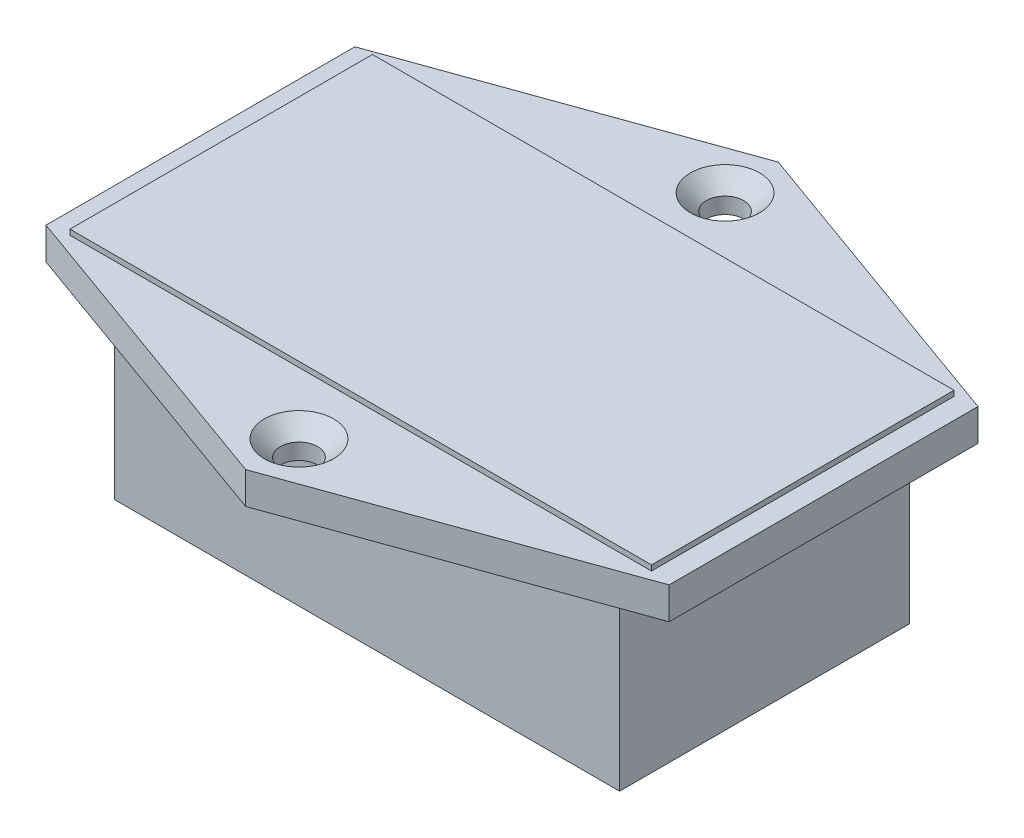
ISO-10303-21;
HEADER;
FILE_DESCRIPTION(('STEP AP214'),'2;1');
FILE_NAME('part.step','',(''),(''),'','','');
FILE_SCHEMA(('AUTOMOTIVE_DESIGN { 1 0 10303 214 1 1 1 1 }'));
ENDSEC;
DATA;
#1=APPLICATION_CONTEXT('core data for automotive mechanical design processes');
#2=APPLICATION_PROTOCOL_DEFINITION('international standard','automotive_design',2000,#1);
#3=PRODUCT_CONTEXT('',#1,'mechanical');
#4=PRODUCT('Part','Part','',(#3));
#5=PRODUCT_RELATED_PRODUCT_CATEGORY('part','',(#4));
#6=PRODUCT_DEFINITION_FORMATION('','',#4);
#7=PRODUCT_DEFINITION_CONTEXT('part definition',#1,'design');
#8=PRODUCT_DEFINITION('design','',#6,#7);
#9=PRODUCT_DEFINITION_SHAPE('','',#8);
#10=(LENGTH_UNIT() NAMED_UNIT(*) SI_UNIT(.MILLI.,.METRE.));
#11=(NAMED_UNIT(*) PLANE_ANGLE_UNIT() SI_UNIT($,.RADIAN.));
#12=(NAMED_UNIT(*) SI_UNIT($,.STERADIAN.) SOLID_ANGLE_UNIT());
#13=UNCERTAINTY_MEASURE_WITH_UNIT(LENGTH_MEASURE(1.E-05),#10,'distance_accuracy_value','');
#14=(GEOMETRIC_REPRESENTATION_CONTEXT(3) GLOBAL_UNCERTAINTY_ASSIGNED_CONTEXT((#13)) GLOBAL_UNIT_ASSIGNED_CONTEXT((#10,
#11,#12)) REPRESENTATION_CONTEXT('',''));
#15=CARTESIAN_POINT('',(0.,0.,0.));
#16=DIRECTION('',(0.,0.,1.));
#17=DIRECTION('',(1.,0.,0.));
#18=AXIS2_PLACEMENT_3D('',#15,#16,#17);
#19=CARTESIAN_POINT('',(0.,-3.,0.));
#20=DIRECTION('',(0.,-1.,0.));
#21=DIRECTION('',(0.,0.,-1.));
#22=AXIS2_PLACEMENT_3D('',#19,#20,#21);
#23=PLANE('',#22);
#24=CARTESIAN_POINT('',(0.,-3.,-20.));
#25=DIRECTION('',(0.,-1.,0.));
#26=DIRECTION('',(0.,0.,-1.));
#27=AXIS2_PLACEMENT_3D('',#24,#25,#26);
#28=CIRCLE('',#27,1.75);
#29=CARTESIAN_POINT('',(0.,-3.,-21.75));
#30=VERTEX_POINT('',#29);
#31=EDGE_CURVE('E149',#30,#30,#28,.T.);
#32=ORIENTED_EDGE('',*,*,#31,.F.);
#33=EDGE_LOOP('',(#32));
#34=FACE_BOUND('',#33,.T.);
#35=DIRECTION('',(-0.941194670761707,0.,-0.337864753606767));
#36=VECTOR('',#35,1.);
#37=CARTESIAN_POINT('',(0.,-3.,25.));
#38=LINE('',#37,#36);
#39=CARTESIAN_POINT('',(0.,-3.,25.));
#40=VERTEX_POINT('',#39);
#41=CARTESIAN_POINT('',(-29.25,-3.,14.5));
#42=VERTEX_POINT('',#41);
#43=EDGE_CURVE('E169',#40,#42,#38,.T.);
#44=ORIENTED_EDGE('',*,*,#43,.T.);
#45=DIRECTION('',(0.,0.,-1.));
#46=VECTOR('',#45,1.);
#47=CARTESIAN_POINT('',(-29.25,-3.,14.5));
#48=LINE('',#47,#46);
#49=CARTESIAN_POINT('',(-29.25,-3.,-14.5));
#50=VERTEX_POINT('',#49);
#51=EDGE_CURVE('E190',#42,#50,#48,.T.);
#52=ORIENTED_EDGE('',*,*,#51,.T.);
#53=DIRECTION('',(0.941194670761707,0.,-0.337864753606767));
#54=VECTOR('',#53,1.);
#55=CARTESIAN_POINT('',(-29.25,-3.,-14.5));
#56=LINE('',#55,#54);
#57=CARTESIAN_POINT('',(0.,-3.,-25.));
#58=VERTEX_POINT('',#57);
#59=EDGE_CURVE('E323',#50,#58,#56,.T.);
#60=ORIENTED_EDGE('',*,*,#59,.T.);
#61=DIRECTION('',(0.941194670761707,0.,0.337864753606767));
#62=VECTOR('',#61,1.);
#63=CARTESIAN_POINT('',(0.,-3.,-25.));
#64=LINE('',#63,#62);
#65=CARTESIAN_POINT('',(29.25,-3.,-14.5));
#66=VERTEX_POINT('',#65);
#67=EDGE_CURVE('E325',#58,#66,#64,.T.);
#68=ORIENTED_EDGE('',*,*,#67,.T.);
#69=DIRECTION('',(0.,0.,1.));
#70=VECTOR('',#69,1.);
#71=CARTESIAN_POINT('',(29.25,-3.,-14.5));
#72=LINE('',#71,#70);
#73=CARTESIAN_POINT('',(29.25,-3.,14.5));
#74=VERTEX_POINT('',#73);
#75=EDGE_CURVE('E326',#66,#74,#72,.T.);
#76=ORIENTED_EDGE('',*,*,#75,.T.);
#77=DIRECTION('',(-0.941194670761707,0.,0.337864753606767));
#78=VECTOR('',#77,1.);
#79=CARTESIAN_POINT('',(29.25,-3.,14.5));
#80=LINE('',#79,#78);
#81=EDGE_CURVE('E157',#74,#40,#80,.T.);
#82=ORIENTED_EDGE('',*,*,#81,.T.);
#83=EDGE_LOOP('',(#44,#52,#60,#68,#76,#82));
#84=FACE_BOUND('',#83,.T.);
#85=CARTESIAN_POINT('',(0.,-3.,20.));
#86=DIRECTION('',(0.,-1.,0.));
#87=DIRECTION('',(0.,0.,-1.));
#88=AXIS2_PLACEMENT_3D('',#85,#86,#87);
#89=CIRCLE('',#88,1.75);
#90=CARTESIAN_POINT('',(0.,-3.,18.25));
#91=VERTEX_POINT('',#90);
#92=EDGE_CURVE('E154',#91,#91,#89,.T.);
#93=ORIENTED_EDGE('',*,*,#92,.F.);
#94=EDGE_LOOP('',(#93));
#95=FACE_BOUND('',#94,.T.);
#96=DIRECTION('',(1.,0.,0.));
#97=VECTOR('',#96,1.);
#98=CARTESIAN_POINT('',(23.7,-3.,-13.6));
#99=LINE('',#98,#97);
#100=CARTESIAN_POINT('',(-23.7,-3.,-13.6));
#101=VERTEX_POINT('',#100);
#102=CARTESIAN_POINT('',(23.7,-3.,-13.6));
#103=VERTEX_POINT('',#102);
#104=EDGE_CURVE('E341',#101,#103,#99,.T.);
#105=ORIENTED_EDGE('',*,*,#104,.F.);
#106=DIRECTION('',(0.,0.,-1.));
#107=VECTOR('',#106,1.);
#108=CARTESIAN_POINT('',(-23.7,-3.,-13.6));
#109=LINE('',#108,#107);
#110=CARTESIAN_POINT('',(-23.7,-3.,13.6));
#111=VERTEX_POINT('',#110);
#112=EDGE_CURVE('E310',#111,#101,#109,.T.);
#113=ORIENTED_EDGE('',*,*,#112,.F.);
#114=DIRECTION('',(-1.,0.,0.));
#115=VECTOR('',#114,1.);
#116=CARTESIAN_POINT('',(23.7,-3.,13.6));
#117=LINE('',#116,#115);
#118=CARTESIAN_POINT('',(23.7,-3.,13.6));
#119=VERTEX_POINT('',#118);
#120=EDGE_CURVE('E303',#119,#111,#117,.T.);
#121=ORIENTED_EDGE('',*,*,#120,.F.);
#122=DIRECTION('',(0.,0.,1.));
#123=VECTOR('',#122,1.);
#124=CARTESIAN_POINT('',(23.7,-3.,-13.6));
#125=LINE('',#124,#123);
#126=EDGE_CURVE('E344',#103,#119,#125,.T.);
#127=ORIENTED_EDGE('',*,*,#126,.F.);
#128=EDGE_LOOP('',(#105,#113,#121,#127));
#129=FACE_BOUND('',#128,.T.);
#130=ADVANCED_FACE('F17',(#34,#84,#95,#129),#23,.T.);
#131=CARTESIAN_POINT('',(-27.3,0.5,14.2));
#132=DIRECTION('',(1.,0.,0.));
#133=DIRECTION('',(0.,0.,-1.));
#134=AXIS2_PLACEMENT_3D('',#131,#132,#133);
#135=PLANE('',#134);
#136=DIRECTION('',(0.,0.,1.));
#137=VECTOR('',#136,1.);
#138=CARTESIAN_POINT('',(-27.3,0.,14.2));
#139=LINE('',#138,#137);
#140=CARTESIAN_POINT('',(-27.3,0.,-14.2));
#141=VERTEX_POINT('',#140);
#142=CARTESIAN_POINT('',(-27.3,0.,14.2));
#143=VERTEX_POINT('',#142);
#144=EDGE_CURVE('E54',#141,#143,#139,.T.);
#145=ORIENTED_EDGE('',*,*,#144,.T.);
#146=DIRECTION('',(0.,-1.,0.));
#147=VECTOR('',#146,1.);
#148=CARTESIAN_POINT('',(-27.3,0.5,14.2));
#149=LINE('',#148,#147);
#150=CARTESIAN_POINT('',(-27.3,0.5,14.2));
#151=VERTEX_POINT('',#150);
#152=EDGE_CURVE('E84',#151,#143,#149,.T.);
#153=ORIENTED_EDGE('',*,*,#152,.F.);
#154=DIRECTION('',(0.,0.,1.));
#155=VECTOR('',#154,1.);
#156=CARTESIAN_POINT('',(-27.3,0.5,14.2));
#157=LINE('',#156,#155);
#158=CARTESIAN_POINT('',(-27.3,0.5,-14.2));
#159=VERTEX_POINT('',#158);
#160=EDGE_CURVE('E75',#159,#151,#157,.T.);
#161=ORIENTED_EDGE('',*,*,#160,.F.);
#162=DIRECTION('',(0.,-1.,0.));
#163=VECTOR('',#162,1.);
#164=CARTESIAN_POINT('',(-27.3,0.5,-14.2));
#165=LINE('',#164,#163);
#166=EDGE_CURVE('E90',#159,#141,#165,.T.);
#167=ORIENTED_EDGE('',*,*,#166,.T.);
#168=EDGE_LOOP('',(#145,#153,#161,#167));
#169=FACE_BOUND('',#168,.T.);
#170=ADVANCED_FACE('F222',(#169),#135,.F.);
#171=CARTESIAN_POINT('',(27.3,0.5,14.2));
#172=DIRECTION('',(0.,0.,-1.));
#173=DIRECTION('',(-1.,0.,0.));
#174=AXIS2_PLACEMENT_3D('',#171,#172,#173);
#175=PLANE('',#174);
#176=DIRECTION('',(1.,0.,0.));
#177=VECTOR('',#176,1.);
#178=CARTESIAN_POINT('',(27.3,0.,14.2));
#179=LINE('',#178,#177);
#180=CARTESIAN_POINT('',(27.3,0.,14.2));
#181=VERTEX_POINT('',#180);
#182=EDGE_CURVE('E62',#143,#181,#179,.T.);
#183=ORIENTED_EDGE('',*,*,#182,.T.);
#184=DIRECTION('',(0.,-1.,0.));
#185=VECTOR('',#184,1.);
#186=CARTESIAN_POINT('',(27.3,0.5,14.2));
#187=LINE('',#186,#185);
#188=CARTESIAN_POINT('',(27.3,0.5,14.2));
#189=VERTEX_POINT('',#188);
#190=EDGE_CURVE('E80',#189,#181,#187,.T.);
#191=ORIENTED_EDGE('',*,*,#190,.F.);
#192=DIRECTION('',(1.,0.,0.));
#193=VECTOR('',#192,1.);
#194=CARTESIAN_POINT('',(27.3,0.5,14.2));
#195=LINE('',#194,#193);
#196=EDGE_CURVE('E68',#151,#189,#195,.T.);
#197=ORIENTED_EDGE('',*,*,#196,.F.);
#198=ORIENTED_EDGE('',*,*,#152,.T.);
#199=EDGE_LOOP('',(#183,#191,#197,#198));
#200=FACE_BOUND('',#199,.T.);
#201=ADVANCED_FACE('F81',(#200),#175,.F.);
#202=CARTESIAN_POINT('',(27.3,0.5,14.2));
#203=DIRECTION('',(-1.,0.,0.));
#204=DIRECTION('',(0.,0.,1.));
#205=AXIS2_PLACEMENT_3D('',#202,#203,#204);
#206=PLANE('',#205);
#207=DIRECTION('',(0.,0.,-1.));
#208=VECTOR('',#207,1.);
#209=CARTESIAN_POINT('',(27.3,0.,14.2));
#210=LINE('',#209,#208);
#211=CARTESIAN_POINT('',(27.3,0.,-14.2));
#212=VERTEX_POINT('',#211);
#213=EDGE_CURVE('E97',#181,#212,#210,.T.);
#214=ORIENTED_EDGE('',*,*,#213,.T.);
#215=DIRECTION('',(0.,-1.,0.));
#216=VECTOR('',#215,1.);
#217=CARTESIAN_POINT('',(27.3,0.5,-14.2));
#218=LINE('',#217,#216);
#219=CARTESIAN_POINT('',(27.3,0.5,-14.2));
#220=VERTEX_POINT('',#219);
#221=EDGE_CURVE('E85',#220,#212,#218,.T.);
#222=ORIENTED_EDGE('',*,*,#221,.F.);
#223=DIRECTION('',(0.,0.,-1.));
#224=VECTOR('',#223,1.);
#225=CARTESIAN_POINT('',(27.3,0.5,14.2));
#226=LINE('',#225,#224);
#227=EDGE_CURVE('E72',#189,#220,#226,.T.);
#228=ORIENTED_EDGE('',*,*,#227,.F.);
#229=ORIENTED_EDGE('',*,*,#190,.T.);
#230=EDGE_LOOP('',(#214,#222,#228,#229));
#231=FACE_BOUND('',#230,.T.);
#232=ADVANCED_FACE('F87',(#231),#206,.F.);
#233=CARTESIAN_POINT('',(27.3,0.5,-14.2));
#234=DIRECTION('',(0.,0.,1.));
#235=DIRECTION('',(1.,0.,0.));
#236=AXIS2_PLACEMENT_3D('',#233,#234,#235);
#237=PLANE('',#236);
#238=DIRECTION('',(-1.,0.,0.));
#239=VECTOR('',#238,1.);
#240=CARTESIAN_POINT('',(27.3,0.,-14.2));
#241=LINE('',#240,#239);
#242=EDGE_CURVE('E99',#212,#141,#241,.T.);
#243=ORIENTED_EDGE('',*,*,#242,.T.);
#244=ORIENTED_EDGE('',*,*,#166,.F.);
#245=DIRECTION('',(-1.,0.,0.));
#246=VECTOR('',#245,1.);
#247=CARTESIAN_POINT('',(27.3,0.5,-14.2));
#248=LINE('',#247,#246);
#249=EDGE_CURVE('E41',#220,#159,#248,.T.);
#250=ORIENTED_EDGE('',*,*,#249,.F.);
#251=ORIENTED_EDGE('',*,*,#221,.T.);
#252=EDGE_LOOP('',(#243,#244,#250,#251));
#253=FACE_BOUND('',#252,.T.);
#254=ADVANCED_FACE('F220',(#253),#237,.F.);
#255=CARTESIAN_POINT('',(0.,0.5,0.));
#256=DIRECTION('',(0.,1.,0.));
#257=DIRECTION('',(0.,0.,1.));
#258=AXIS2_PLACEMENT_3D('',#255,#256,#257);
#259=PLANE('',#258);
#260=ORIENTED_EDGE('',*,*,#160,.T.);
#261=ORIENTED_EDGE('',*,*,#196,.T.);
#262=ORIENTED_EDGE('',*,*,#227,.T.);
#263=ORIENTED_EDGE('',*,*,#249,.T.);
#264=EDGE_LOOP('',(#260,#261,#262,#263));
#265=FACE_BOUND('',#264,.T.);
#266=ADVANCED_FACE('F70',(#265),#259,.T.);
#267=CARTESIAN_POINT('',(0.,0.,0.));
#268=DIRECTION('',(0.,-1.,0.));
#269=DIRECTION('',(0.,0.,-1.));
#270=AXIS2_PLACEMENT_3D('',#267,#268,#269);
#271=PLANE('',#270);
#272=CARTESIAN_POINT('',(0.,0.,-20.));
#273=DIRECTION('',(0.,-1.,0.));
#274=DIRECTION('',(0.,0.,-1.));
#275=AXIS2_PLACEMENT_3D('',#272,#273,#274);
#276=CIRCLE('',#275,3.25);
#277=CARTESIAN_POINT('',(0.,0.,-23.25));
#278=VERTEX_POINT('',#277);
#279=EDGE_CURVE('E108',#278,#278,#276,.T.);
#280=ORIENTED_EDGE('',*,*,#279,.T.);
#281=EDGE_LOOP('',(#280));
#282=FACE_BOUND('',#281,.T.);
#283=CARTESIAN_POINT('',(0.,0.,20.));
#284=DIRECTION('',(0.,-1.,0.));
#285=DIRECTION('',(0.,0.,-1.));
#286=AXIS2_PLACEMENT_3D('',#283,#284,#285);
#287=CIRCLE('',#286,3.25);
#288=CARTESIAN_POINT('',(0.,0.,16.75));
#289=VERTEX_POINT('',#288);
#290=EDGE_CURVE('E105',#289,#289,#287,.T.);
#291=ORIENTED_EDGE('',*,*,#290,.T.);
#292=EDGE_LOOP('',(#291));
#293=FACE_BOUND('',#292,.T.);
#294=DIRECTION('',(-0.941194670761707,0.,-0.337864753606767));
#295=VECTOR('',#294,1.);
#296=CARTESIAN_POINT('',(0.,0.,25.));
#297=LINE('',#296,#295);
#298=CARTESIAN_POINT('',(0.,0.,25.));
#299=VERTEX_POINT('',#298);
#300=CARTESIAN_POINT('',(-29.25,0.,14.5));
#301=VERTEX_POINT('',#300);
#302=EDGE_CURVE('E134',#299,#301,#297,.T.);
#303=ORIENTED_EDGE('',*,*,#302,.F.);
#304=DIRECTION('',(-0.941194670761707,0.,0.337864753606767));
#305=VECTOR('',#304,1.);
#306=CARTESIAN_POINT('',(29.25,0.,14.5));
#307=LINE('',#306,#305);
#308=CARTESIAN_POINT('',(29.25,0.,14.5));
#309=VERTEX_POINT('',#308);
#310=EDGE_CURVE('E138',#309,#299,#307,.T.);
#311=ORIENTED_EDGE('',*,*,#310,.F.);
#312=DIRECTION('',(0.,0.,1.));
#313=VECTOR('',#312,1.);
#314=CARTESIAN_POINT('',(29.25,0.,-14.5));
#315=LINE('',#314,#313);
#316=CARTESIAN_POINT('',(29.25,0.,-14.5));
#317=VERTEX_POINT('',#316);
#318=EDGE_CURVE('E165',#317,#309,#315,.T.);
#319=ORIENTED_EDGE('',*,*,#318,.F.);
#320=DIRECTION('',(0.941194670761707,0.,0.337864753606767));
#321=VECTOR('',#320,1.);
#322=CARTESIAN_POINT('',(0.,0.,-25.));
#323=LINE('',#322,#321);
#324=CARTESIAN_POINT('',(0.,0.,-25.));
#325=VERTEX_POINT('',#324);
#326=EDGE_CURVE('E162',#325,#317,#323,.T.);
#327=ORIENTED_EDGE('',*,*,#326,.F.);
#328=DIRECTION('',(0.941194670761707,0.,-0.337864753606767));
#329=VECTOR('',#328,1.);
#330=CARTESIAN_POINT('',(-29.25,0.,-14.5));
#331=LINE('',#330,#329);
#332=CARTESIAN_POINT('',(-29.25,0.,-14.5));
#333=VERTEX_POINT('',#332);
#334=EDGE_CURVE('E151',#333,#325,#331,.T.);
#335=ORIENTED_EDGE('',*,*,#334,.F.);
#336=DIRECTION('',(0.,0.,-1.));
#337=VECTOR('',#336,1.);
#338=CARTESIAN_POINT('',(-29.25,0.,14.5));
#339=LINE('',#338,#337);
#340=EDGE_CURVE('E142',#301,#333,#339,.T.);
#341=ORIENTED_EDGE('',*,*,#340,.F.);
#342=EDGE_LOOP('',(#303,#311,#319,#327,#335,#341));
#343=FACE_BOUND('',#342,.T.);
#344=ORIENTED_EDGE('',*,*,#182,.F.);
#345=ORIENTED_EDGE('',*,*,#144,.F.);
#346=ORIENTED_EDGE('',*,*,#242,.F.);
#347=ORIENTED_EDGE('',*,*,#213,.F.);
#348=EDGE_LOOP('',(#344,#345,#346,#347));
#349=FACE_BOUND('',#348,.T.);
#350=ADVANCED_FACE('F122',(#282,#293,#343,#349),#271,.F.);
#351=CARTESIAN_POINT('',(0.,-3.,25.));
#352=DIRECTION('',(0.337864753606767,0.,-0.941194670761707));
#353=DIRECTION('',(-0.941194670761707,0.,-0.337864753606767));
#354=AXIS2_PLACEMENT_3D('',#351,#352,#353);
#355=PLANE('',#354);
#356=ORIENTED_EDGE('',*,*,#302,.T.);
#357=DIRECTION('',(0.,1.,0.));
#358=VECTOR('',#357,1.);
#359=CARTESIAN_POINT('',(-29.25,-3.,14.5));
#360=LINE('',#359,#358);
#361=EDGE_CURVE('E95',#42,#301,#360,.T.);
#362=ORIENTED_EDGE('',*,*,#361,.F.);
#363=ORIENTED_EDGE('',*,*,#43,.F.);
#364=DIRECTION('',(0.,1.,0.));
#365=VECTOR('',#364,1.);
#366=CARTESIAN_POINT('',(0.,-3.,25.));
#367=LINE('',#366,#365);
#368=EDGE_CURVE('E170',#40,#299,#367,.T.);
#369=ORIENTED_EDGE('',*,*,#368,.T.);
#370=EDGE_LOOP('',(#356,#362,#363,#369));
#371=FACE_BOUND('',#370,.T.);
#372=ADVANCED_FACE('F125',(#371),#355,.F.);
#373=CARTESIAN_POINT('',(-29.25,-3.,14.5));
#374=DIRECTION('',(1.,0.,0.));
#375=DIRECTION('',(0.,0.,-1.));
#376=AXIS2_PLACEMENT_3D('',#373,#374,#375);
#377=PLANE('',#376);
#378=ORIENTED_EDGE('',*,*,#340,.T.);
#379=DIRECTION('',(0.,1.,0.));
#380=VECTOR('',#379,1.);
#381=CARTESIAN_POINT('',(-29.25,-3.,-14.5));
#382=LINE('',#381,#380);
#383=EDGE_CURVE('E181',#50,#333,#382,.T.);
#384=ORIENTED_EDGE('',*,*,#383,.F.);
#385=ORIENTED_EDGE('',*,*,#51,.F.);
#386=ORIENTED_EDGE('',*,*,#361,.T.);
#387=EDGE_LOOP('',(#378,#384,#385,#386));
#388=FACE_BOUND('',#387,.T.);
#389=ADVANCED_FACE('F186',(#388),#377,.F.);
#390=CARTESIAN_POINT('',(-29.25,-3.,-14.5));
#391=DIRECTION('',(0.337864753606767,0.,0.941194670761707));
#392=DIRECTION('',(0.941194670761707,0.,-0.337864753606767));
#393=AXIS2_PLACEMENT_3D('',#390,#391,#392);
#394=PLANE('',#393);
#395=ORIENTED_EDGE('',*,*,#334,.T.);
#396=DIRECTION('',(0.,1.,0.));
#397=VECTOR('',#396,1.);
#398=CARTESIAN_POINT('',(0.,-3.,-25.));
#399=LINE('',#398,#397);
#400=EDGE_CURVE('E178',#58,#325,#399,.T.);
#401=ORIENTED_EDGE('',*,*,#400,.F.);
#402=ORIENTED_EDGE('',*,*,#59,.F.);
#403=ORIENTED_EDGE('',*,*,#383,.T.);
#404=EDGE_LOOP('',(#395,#401,#402,#403));
#405=FACE_BOUND('',#404,.T.);
#406=ADVANCED_FACE('F245',(#405),#394,.F.);
#407=CARTESIAN_POINT('',(0.,-3.,-25.));
#408=DIRECTION('',(-0.337864753606767,0.,0.941194670761707));
#409=DIRECTION('',(0.941194670761707,0.,0.337864753606767));
#410=AXIS2_PLACEMENT_3D('',#407,#408,#409);
#411=PLANE('',#410);
#412=ORIENTED_EDGE('',*,*,#326,.T.);
#413=DIRECTION('',(0.,1.,0.));
#414=VECTOR('',#413,1.);
#415=CARTESIAN_POINT('',(29.25,-3.,-14.5));
#416=LINE('',#415,#414);
#417=EDGE_CURVE('E175',#66,#317,#416,.T.);
#418=ORIENTED_EDGE('',*,*,#417,.F.);
#419=ORIENTED_EDGE('',*,*,#67,.F.);
#420=ORIENTED_EDGE('',*,*,#400,.T.);
#421=EDGE_LOOP('',(#412,#418,#419,#420));
#422=FACE_BOUND('',#421,.T.);
#423=ADVANCED_FACE('F248',(#422),#411,.F.);
#424=CARTESIAN_POINT('',(29.25,-3.,-14.5));
#425=DIRECTION('',(-1.,0.,0.));
#426=DIRECTION('',(0.,0.,1.));
#427=AXIS2_PLACEMENT_3D('',#424,#425,#426);
#428=PLANE('',#427);
#429=ORIENTED_EDGE('',*,*,#318,.T.);
#430=DIRECTION('',(0.,1.,0.));
#431=VECTOR('',#430,1.);
#432=CARTESIAN_POINT('',(29.25,-3.,14.5));
#433=LINE('',#432,#431);
#434=EDGE_CURVE('E172',#74,#309,#433,.T.);
#435=ORIENTED_EDGE('',*,*,#434,.F.);
#436=ORIENTED_EDGE('',*,*,#75,.F.);
#437=ORIENTED_EDGE('',*,*,#417,.T.);
#438=EDGE_LOOP('',(#429,#435,#436,#437));
#439=FACE_BOUND('',#438,.T.);
#440=ADVANCED_FACE('F252',(#439),#428,.F.);
#441=CARTESIAN_POINT('',(29.25,-3.,14.5));
#442=DIRECTION('',(-0.337864753606767,0.,-0.941194670761707));
#443=DIRECTION('',(-0.941194670761707,0.,0.337864753606767));
#444=AXIS2_PLACEMENT_3D('',#441,#442,#443);
#445=PLANE('',#444);
#446=ORIENTED_EDGE('',*,*,#310,.T.);
#447=ORIENTED_EDGE('',*,*,#368,.F.);
#448=ORIENTED_EDGE('',*,*,#81,.F.);
#449=ORIENTED_EDGE('',*,*,#434,.T.);
#450=EDGE_LOOP('',(#446,#447,#448,#449));
#451=FACE_BOUND('',#450,.T.);
#452=ADVANCED_FACE('F256',(#451),#445,.F.);
#453=CARTESIAN_POINT('',(0.,-3.,-20.));
#454=DIRECTION('',(0.,1.,0.));
#455=DIRECTION('',(0.,0.,1.));
#456=AXIS2_PLACEMENT_3D('',#453,#454,#455);
#457=CYLINDRICAL_SURFACE('',#456,1.75);
#458=CARTESIAN_POINT('',(0.,-1.5,-20.));
#459=DIRECTION('',(0.,-1.,0.));
#460=DIRECTION('',(0.,0.,-1.));
#461=AXIS2_PLACEMENT_3D('',#458,#459,#460);
#462=CIRCLE('',#461,1.75);
#463=CARTESIAN_POINT('',(0.,-1.5,-21.75));
#464=VERTEX_POINT('',#463);
#465=EDGE_CURVE('E25',#464,#464,#462,.F.);
#466=ORIENTED_EDGE('',*,*,#465,.T.);
#467=EDGE_LOOP('',(#466));
#468=FACE_BOUND('',#467,.T.);
#469=ORIENTED_EDGE('',*,*,#31,.T.);
#470=EDGE_LOOP('',(#469));
#471=FACE_BOUND('',#470,.T.);
#472=ADVANCED_FACE('F113',(#468,#471),#457,.F.);
#473=CARTESIAN_POINT('',(0.,-3.,20.));
#474=DIRECTION('',(0.,1.,0.));
#475=DIRECTION('',(0.,0.,1.));
#476=AXIS2_PLACEMENT_3D('',#473,#474,#475);
#477=CYLINDRICAL_SURFACE('',#476,1.75);
#478=CARTESIAN_POINT('',(0.,-1.5,20.));
#479=DIRECTION('',(0.,-1.,0.));
#480=DIRECTION('',(0.,0.,-1.));
#481=AXIS2_PLACEMENT_3D('',#478,#479,#480);
#482=CIRCLE('',#481,1.75);
#483=CARTESIAN_POINT('',(0.,-1.5,18.25));
#484=VERTEX_POINT('',#483);
#485=EDGE_CURVE('E11',#484,#484,#482,.F.);
#486=ORIENTED_EDGE('',*,*,#485,.T.);
#487=EDGE_LOOP('',(#486));
#488=FACE_BOUND('',#487,.T.);
#489=ORIENTED_EDGE('',*,*,#92,.T.);
#490=EDGE_LOOP('',(#489));
#491=FACE_BOUND('',#490,.T.);
#492=ADVANCED_FACE('F119',(#488,#491),#477,.F.);
#493=CARTESIAN_POINT('',(0.,0.,-20.));
#494=DIRECTION('',(0.,1.,0.));
#495=DIRECTION('',(0.,0.,1.));
#496=AXIS2_PLACEMENT_3D('',#493,#494,#495);
#497=CONICAL_SURFACE('',#496,3.25,0.785398163397447);
#498=ORIENTED_EDGE('',*,*,#465,.F.);
#499=EDGE_LOOP('',(#498));
#500=FACE_BOUND('',#499,.T.);
#501=ORIENTED_EDGE('',*,*,#279,.F.);
#502=EDGE_LOOP('',(#501));
#503=FACE_BOUND('',#502,.T.);
#504=ADVANCED_FACE('F116',(#500,#503),#497,.F.);
#505=CARTESIAN_POINT('',(0.,0.,20.));
#506=DIRECTION('',(0.,1.,0.));
#507=DIRECTION('',(0.,0.,1.));
#508=AXIS2_PLACEMENT_3D('',#505,#506,#507);
#509=CONICAL_SURFACE('',#508,3.25,0.785398163397447);
#510=ORIENTED_EDGE('',*,*,#485,.F.);
#511=EDGE_LOOP('',(#510));
#512=FACE_BOUND('',#511,.T.);
#513=ORIENTED_EDGE('',*,*,#290,.F.);
#514=EDGE_LOOP('',(#513));
#515=FACE_BOUND('',#514,.T.);
#516=ADVANCED_FACE('F19',(#512,#515),#509,.F.);
#517=CARTESIAN_POINT('',(-23.7,-20.,-13.6));
#518=DIRECTION('',(1.,0.,0.));
#519=DIRECTION('',(0.,0.,-1.));
#520=AXIS2_PLACEMENT_3D('',#517,#518,#519);
#521=PLANE('',#520);
#522=ORIENTED_EDGE('',*,*,#112,.T.);
#523=DIRECTION('',(0.,1.,0.));
#524=VECTOR('',#523,1.);
#525=CARTESIAN_POINT('',(-23.7,-20.,-13.6));
#526=LINE('',#525,#524);
#527=CARTESIAN_POINT('',(-23.7,-20.,-13.6));
#528=VERTEX_POINT('',#527);
#529=EDGE_CURVE('E307',#528,#101,#526,.T.);
#530=ORIENTED_EDGE('',*,*,#529,.F.);
#531=DIRECTION('',(0.,0.,-1.));
#532=VECTOR('',#531,1.);
#533=CARTESIAN_POINT('',(-23.7,-20.,-13.6));
#534=LINE('',#533,#532);
#535=CARTESIAN_POINT('',(-23.7,-20.,13.6));
#536=VERTEX_POINT('',#535);
#537=EDGE_CURVE('E292',#536,#528,#534,.T.);
#538=ORIENTED_EDGE('',*,*,#537,.F.);
#539=DIRECTION('',(0.,1.,0.));
#540=VECTOR('',#539,1.);
#541=CARTESIAN_POINT('',(-23.7,-20.,13.6));
#542=LINE('',#541,#540);
#543=EDGE_CURVE('E352',#536,#111,#542,.T.);
#544=ORIENTED_EDGE('',*,*,#543,.T.);
#545=EDGE_LOOP('',(#522,#530,#538,#544));
#546=FACE_BOUND('',#545,.T.);
#547=ADVANCED_FACE('F266',(#546),#521,.F.);
#548=CARTESIAN_POINT('',(23.7,-20.,-13.6));
#549=DIRECTION('',(0.,0.,1.));
#550=DIRECTION('',(1.,0.,0.));
#551=AXIS2_PLACEMENT_3D('',#548,#549,#550);
#552=PLANE('',#551);
#553=ORIENTED_EDGE('',*,*,#104,.T.);
#554=DIRECTION('',(0.,1.,0.));
#555=VECTOR('',#554,1.);
#556=CARTESIAN_POINT('',(23.7,-20.,-13.6));
#557=LINE('',#556,#555);
#558=CARTESIAN_POINT('',(23.7,-20.,-13.6));
#559=VERTEX_POINT('',#558);
#560=EDGE_CURVE('E313',#559,#103,#557,.T.);
#561=ORIENTED_EDGE('',*,*,#560,.F.);
#562=DIRECTION('',(1.,0.,0.));
#563=VECTOR('',#562,1.);
#564=CARTESIAN_POINT('',(23.7,-20.,-13.6));
#565=LINE('',#564,#563);
#566=EDGE_CURVE('E297',#528,#559,#565,.T.);
#567=ORIENTED_EDGE('',*,*,#566,.F.);
#568=ORIENTED_EDGE('',*,*,#529,.T.);
#569=EDGE_LOOP('',(#553,#561,#567,#568));
#570=FACE_BOUND('',#569,.T.);
#571=ADVANCED_FACE('F269',(#570),#552,.F.);
#572=CARTESIAN_POINT('',(23.7,-20.,-13.6));
#573=DIRECTION('',(-1.,0.,0.));
#574=DIRECTION('',(0.,0.,1.));
#575=AXIS2_PLACEMENT_3D('',#572,#573,#574);
#576=PLANE('',#575);
#577=ORIENTED_EDGE('',*,*,#126,.T.);
#578=DIRECTION('',(0.,1.,0.));
#579=VECTOR('',#578,1.);
#580=CARTESIAN_POINT('',(23.7,-20.,13.6));
#581=LINE('',#580,#579);
#582=CARTESIAN_POINT('',(23.7,-20.,13.6));
#583=VERTEX_POINT('',#582);
#584=EDGE_CURVE('E32',#583,#119,#581,.T.);
#585=ORIENTED_EDGE('',*,*,#584,.F.);
#586=DIRECTION('',(0.,0.,1.));
#587=VECTOR('',#586,1.);
#588=CARTESIAN_POINT('',(23.7,-20.,-13.6));
#589=LINE('',#588,#587);
#590=EDGE_CURVE('E353',#559,#583,#589,.T.);
#591=ORIENTED_EDGE('',*,*,#590,.F.);
#592=ORIENTED_EDGE('',*,*,#560,.T.);
#593=EDGE_LOOP('',(#577,#585,#591,#592));
#594=FACE_BOUND('',#593,.T.);
#595=ADVANCED_FACE('F273',(#594),#576,.F.);
#596=CARTESIAN_POINT('',(23.7,-20.,13.6));
#597=DIRECTION('',(0.,0.,-1.));
#598=DIRECTION('',(-1.,0.,0.));
#599=AXIS2_PLACEMENT_3D('',#596,#597,#598);
#600=PLANE('',#599);
#601=ORIENTED_EDGE('',*,*,#120,.T.);
#602=ORIENTED_EDGE('',*,*,#543,.F.);
#603=DIRECTION('',(-1.,0.,0.));
#604=VECTOR('',#603,1.);
#605=CARTESIAN_POINT('',(23.7,-20.,13.6));
#606=LINE('',#605,#604);
#607=EDGE_CURVE('E299',#583,#536,#606,.T.);
#608=ORIENTED_EDGE('',*,*,#607,.F.);
#609=ORIENTED_EDGE('',*,*,#584,.T.);
#610=EDGE_LOOP('',(#601,#602,#608,#609));
#611=FACE_BOUND('',#610,.T.);
#612=ADVANCED_FACE('F277',(#611),#600,.F.);
#613=CARTESIAN_POINT('',(0.,-20.,0.));
#614=DIRECTION('',(0.,-1.,0.));
#615=DIRECTION('',(0.,0.,-1.));
#616=AXIS2_PLACEMENT_3D('',#613,#614,#615);
#617=PLANE('',#616);
#618=ORIENTED_EDGE('',*,*,#537,.T.);
#619=ORIENTED_EDGE('',*,*,#566,.T.);
#620=ORIENTED_EDGE('',*,*,#590,.T.);
#621=ORIENTED_EDGE('',*,*,#607,.T.);
#622=EDGE_LOOP('',(#618,#619,#620,#621));
#623=FACE_BOUND('',#622,.T.);
#624=ADVANCED_FACE('F281',(#623),#617,.T.);
#625=CLOSED_SHELL('',(#130,#170,#201,#232,#254,#266,#350,#372,#389,#406,#423,#440,#452,#472,
#492,#504,#516,#547,#571,#595,#612,#624));
#626=MANIFOLD_SOLID_BREP('B1',#625);
#627=ADVANCED_BREP_SHAPE_REPRESENTATION('',(#18,#626),#14);
#628=SHAPE_DEFINITION_REPRESENTATION(#9,#627);
ENDSEC;
END-ISO-10303-21;
